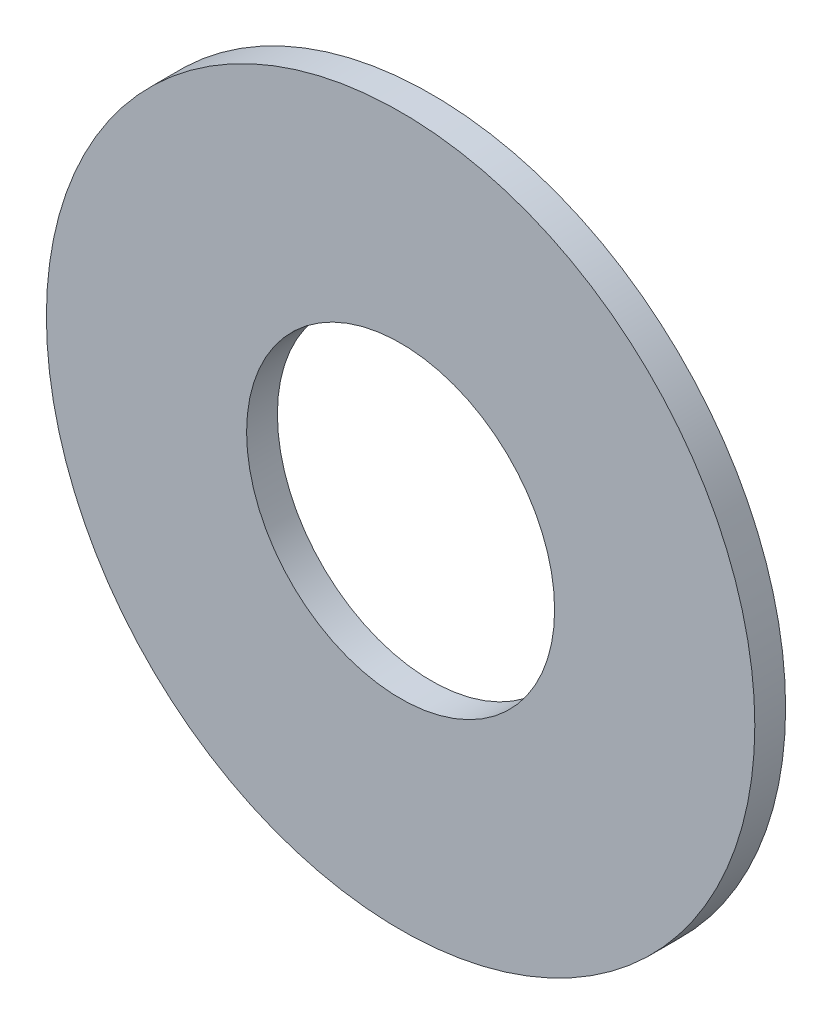
ISO-10303-21;
HEADER;
FILE_DESCRIPTION(('STEP AP214'),'2;1');
FILE_NAME('part.step','',(''),(''),'','','');
FILE_SCHEMA(('AUTOMOTIVE_DESIGN { 1 0 10303 214 1 1 1 1 }'));
ENDSEC;
DATA;
#1=APPLICATION_CONTEXT('core data for automotive mechanical design processes');
#2=APPLICATION_PROTOCOL_DEFINITION('international standard','automotive_design',2000,#1);
#3=PRODUCT_CONTEXT('',#1,'mechanical');
#4=PRODUCT('Part','Part','',(#3));
#5=PRODUCT_RELATED_PRODUCT_CATEGORY('part','',(#4));
#6=PRODUCT_DEFINITION_FORMATION('','',#4);
#7=PRODUCT_DEFINITION_CONTEXT('part definition',#1,'design');
#8=PRODUCT_DEFINITION('design','',#6,#7);
#9=PRODUCT_DEFINITION_SHAPE('','',#8);
#10=(LENGTH_UNIT() NAMED_UNIT(*) SI_UNIT(.MILLI.,.METRE.));
#11=(NAMED_UNIT(*) PLANE_ANGLE_UNIT() SI_UNIT($,.RADIAN.));
#12=(NAMED_UNIT(*) SI_UNIT($,.STERADIAN.) SOLID_ANGLE_UNIT());
#13=UNCERTAINTY_MEASURE_WITH_UNIT(LENGTH_MEASURE(1.E-05),#10,'distance_accuracy_value','');
#14=(GEOMETRIC_REPRESENTATION_CONTEXT(3) GLOBAL_UNCERTAINTY_ASSIGNED_CONTEXT((#13)) GLOBAL_UNIT_ASSIGNED_CONTEXT((#10,
#11,#12)) REPRESENTATION_CONTEXT('',''));
#15=CARTESIAN_POINT('',(0.,0.,0.));
#16=DIRECTION('',(0.,0.,1.));
#17=DIRECTION('',(1.,0.,0.));
#18=AXIS2_PLACEMENT_3D('',#15,#16,#17);
#19=CARTESIAN_POINT('',(0.,0.,2.54));
#20=DIRECTION('',(0.,0.,1.));
#21=DIRECTION('',(1.,0.,0.));
#22=AXIS2_PLACEMENT_3D('',#19,#20,#21);
#23=PLANE('',#22);
#24=CARTESIAN_POINT('',(0.,0.,2.54));
#25=DIRECTION('',(0.,0.,1.));
#26=DIRECTION('',(1.,0.,0.));
#27=AXIS2_PLACEMENT_3D('',#24,#25,#26);
#28=CIRCLE('',#27,29.21);
#29=CARTESIAN_POINT('',(29.21,0.,2.54));
#30=VERTEX_POINT('',#29);
#31=EDGE_CURVE('E10',#30,#30,#28,.T.);
#32=ORIENTED_EDGE('',*,*,#31,.T.);
#33=EDGE_LOOP('',(#32));
#34=FACE_BOUND('',#33,.T.);
#35=CARTESIAN_POINT('',(0.,0.,2.54));
#36=DIRECTION('',(0.,0.,1.));
#37=DIRECTION('',(1.,0.,0.));
#38=AXIS2_PLACEMENT_3D('',#35,#36,#37);
#39=CIRCLE('',#38,12.7);
#40=CARTESIAN_POINT('',(12.7,0.,2.54));
#41=VERTEX_POINT('',#40);
#42=EDGE_CURVE('E42',#41,#41,#39,.T.);
#43=ORIENTED_EDGE('',*,*,#42,.F.);
#44=EDGE_LOOP('',(#43));
#45=FACE_BOUND('',#44,.T.);
#46=ADVANCED_FACE('F31',(#34,#45),#23,.T.);
#47=CARTESIAN_POINT('',(0.,0.,0.));
#48=DIRECTION('',(0.,0.,1.));
#49=DIRECTION('',(1.,0.,0.));
#50=AXIS2_PLACEMENT_3D('',#47,#48,#49);
#51=PLANE('',#50);
#52=CARTESIAN_POINT('',(0.,0.,0.));
#53=DIRECTION('',(0.,0.,1.));
#54=DIRECTION('',(1.,0.,0.));
#55=AXIS2_PLACEMENT_3D('',#52,#53,#54);
#56=CIRCLE('',#55,29.21);
#57=CARTESIAN_POINT('',(29.21,0.,0.));
#58=VERTEX_POINT('',#57);
#59=EDGE_CURVE('E35',#58,#58,#56,.T.);
#60=ORIENTED_EDGE('',*,*,#59,.F.);
#61=EDGE_LOOP('',(#60));
#62=FACE_BOUND('',#61,.T.);
#63=CARTESIAN_POINT('',(0.,0.,0.));
#64=DIRECTION('',(0.,0.,1.));
#65=DIRECTION('',(1.,0.,0.));
#66=AXIS2_PLACEMENT_3D('',#63,#64,#65);
#67=CIRCLE('',#66,12.7);
#68=CARTESIAN_POINT('',(12.7,0.,0.));
#69=VERTEX_POINT('',#68);
#70=EDGE_CURVE('E44',#69,#69,#67,.T.);
#71=ORIENTED_EDGE('',*,*,#70,.T.);
#72=EDGE_LOOP('',(#71));
#73=FACE_BOUND('',#72,.T.);
#74=ADVANCED_FACE('F54',(#62,#73),#51,.F.);
#75=CARTESIAN_POINT('',(0.,0.,2.54));
#76=DIRECTION('',(0.,0.,-1.));
#77=DIRECTION('',(-1.,0.,0.));
#78=AXIS2_PLACEMENT_3D('',#75,#76,#77);
#79=CYLINDRICAL_SURFACE('',#78,29.21);
#80=ORIENTED_EDGE('',*,*,#31,.F.);
#81=EDGE_LOOP('',(#80));
#82=FACE_BOUND('',#81,.T.);
#83=ORIENTED_EDGE('',*,*,#59,.T.);
#84=EDGE_LOOP('',(#83));
#85=FACE_BOUND('',#84,.T.);
#86=ADVANCED_FACE('F33',(#82,#85),#79,.T.);
#87=CARTESIAN_POINT('',(0.,0.,2.54));
#88=DIRECTION('',(0.,0.,-1.));
#89=DIRECTION('',(-1.,0.,0.));
#90=AXIS2_PLACEMENT_3D('',#87,#88,#89);
#91=CYLINDRICAL_SURFACE('',#90,12.7);
#92=ORIENTED_EDGE('',*,*,#42,.T.);
#93=EDGE_LOOP('',(#92));
#94=FACE_BOUND('',#93,.T.);
#95=ORIENTED_EDGE('',*,*,#70,.F.);
#96=EDGE_LOOP('',(#95));
#97=FACE_BOUND('',#96,.T.);
#98=ADVANCED_FACE('F50',(#94,#97),#91,.F.);
#99=CLOSED_SHELL('',(#46,#74,#86,#98));
#100=MANIFOLD_SOLID_BREP('B2',#99);
#101=ADVANCED_BREP_SHAPE_REPRESENTATION('',(#18,#100),#14);
#102=SHAPE_DEFINITION_REPRESENTATION(#9,#101);
ENDSEC;
END-ISO-10303-21;
